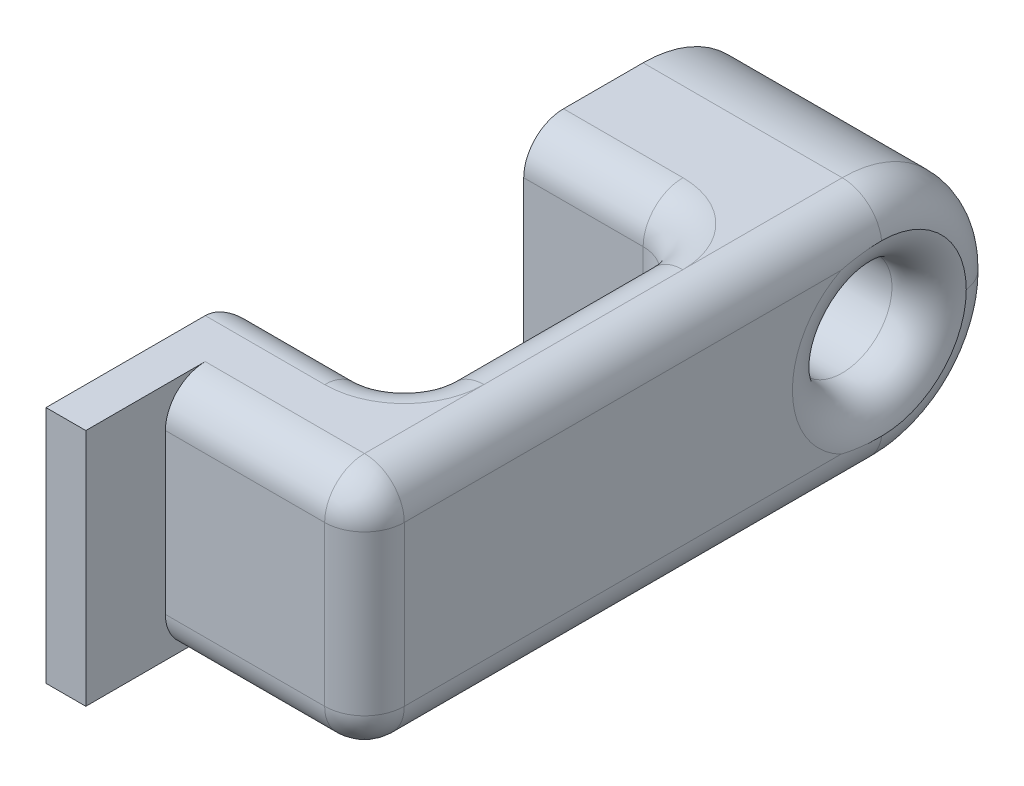
ISO-10303-21;
HEADER;
FILE_DESCRIPTION(('STEP AP214'),'2;1');
FILE_NAME('part.step','',(''),(''),'','','');
FILE_SCHEMA(('AUTOMOTIVE_DESIGN { 1 0 10303 214 1 1 1 1 }'));
ENDSEC;
DATA;
#1=APPLICATION_CONTEXT('core data for automotive mechanical design processes');
#2=APPLICATION_PROTOCOL_DEFINITION('international standard','automotive_design',2000,#1);
#3=PRODUCT_CONTEXT('',#1,'mechanical');
#4=PRODUCT('Part','Part','',(#3));
#5=PRODUCT_RELATED_PRODUCT_CATEGORY('part','',(#4));
#6=PRODUCT_DEFINITION_FORMATION('','',#4);
#7=PRODUCT_DEFINITION_CONTEXT('part definition',#1,'design');
#8=PRODUCT_DEFINITION('design','',#6,#7);
#9=PRODUCT_DEFINITION_SHAPE('','',#8);
#10=(LENGTH_UNIT() NAMED_UNIT(*) SI_UNIT(.MILLI.,.METRE.));
#11=(NAMED_UNIT(*) PLANE_ANGLE_UNIT() SI_UNIT($,.RADIAN.));
#12=(NAMED_UNIT(*) SI_UNIT($,.STERADIAN.) SOLID_ANGLE_UNIT());
#13=UNCERTAINTY_MEASURE_WITH_UNIT(LENGTH_MEASURE(1.E-05),#10,'distance_accuracy_value','');
#14=(GEOMETRIC_REPRESENTATION_CONTEXT(3) GLOBAL_UNCERTAINTY_ASSIGNED_CONTEXT((#13)) GLOBAL_UNIT_ASSIGNED_CONTEXT((#10,
#11,#12)) REPRESENTATION_CONTEXT('',''));
#15=CARTESIAN_POINT('',(0.,0.,0.));
#16=DIRECTION('',(0.,0.,1.));
#17=DIRECTION('',(1.,0.,0.));
#18=AXIS2_PLACEMENT_3D('',#15,#16,#17);
#19=CARTESIAN_POINT('',(0.,0.,0.));
#20=DIRECTION('',(0.,-1.,0.));
#21=DIRECTION('',(0.,0.,-1.));
#22=AXIS2_PLACEMENT_3D('',#19,#20,#21);
#23=PLANE('',#22);
#24=CARTESIAN_POINT('',(3.,0.,-11.));
#25=DIRECTION('',(0.,-1.,0.));
#26=DIRECTION('',(0.,0.,-1.));
#27=AXIS2_PLACEMENT_3D('',#24,#25,#26);
#28=CIRCLE('',#27,2.);
#29=CARTESIAN_POINT('',(3.,0.,-13.));
#30=VERTEX_POINT('',#29);
#31=CARTESIAN_POINT('',(5.,0.,-11.));
#32=VERTEX_POINT('',#31);
#33=EDGE_CURVE('E302',#30,#32,#28,.T.);
#34=ORIENTED_EDGE('',*,*,#33,.F.);
#35=DIRECTION('',(1.,0.,0.));
#36=VECTOR('',#35,1.);
#37=CARTESIAN_POINT('',(0.,0.,-13.));
#38=LINE('',#37,#36);
#39=CARTESIAN_POINT('',(0.,0.,-13.));
#40=VERTEX_POINT('',#39);
#41=EDGE_CURVE('E305',#30,#40,#38,.F.);
#42=ORIENTED_EDGE('',*,*,#41,.T.);
#43=DIRECTION('',(0.,0.,1.));
#44=VECTOR('',#43,1.);
#45=CARTESIAN_POINT('',(0.,0.,-12.));
#46=LINE('',#45,#44);
#47=CARTESIAN_POINT('',(0.,0.,-15.));
#48=VERTEX_POINT('',#47);
#49=EDGE_CURVE('E487',#48,#40,#46,.T.);
#50=ORIENTED_EDGE('',*,*,#49,.F.);
#51=DIRECTION('',(-1.,0.,0.));
#52=VECTOR('',#51,1.);
#53=CARTESIAN_POINT('',(6.,0.,-15.));
#54=LINE('',#53,#52);
#55=CARTESIAN_POINT('',(5.,0.,-15.));
#56=VERTEX_POINT('',#55);
#57=EDGE_CURVE('E244',#48,#56,#54,.F.);
#58=ORIENTED_EDGE('',*,*,#57,.T.);
#59=DIRECTION('',(0.,0.,-1.));
#60=VECTOR('',#59,1.);
#61=CARTESIAN_POINT('',(5.,0.,-2.));
#62=LINE('',#61,#60);
#63=EDGE_CURVE('E300',#56,#32,#62,.F.);
#64=ORIENTED_EDGE('',*,*,#63,.T.);
#65=EDGE_LOOP('',(#34,#42,#50,#58,#64));
#66=FACE_BOUND('',#65,.T.);
#67=ADVANCED_FACE('F39',(#66),#23,.T.);
#68=CARTESIAN_POINT('',(0.,6.,0.));
#69=DIRECTION('',(0.,-1.,0.));
#70=DIRECTION('',(0.,0.,-1.));
#71=AXIS2_PLACEMENT_3D('',#68,#69,#70);
#72=PLANE('',#71);
#73=DIRECTION('',(0.,0.,1.));
#74=VECTOR('',#73,1.);
#75=CARTESIAN_POINT('',(0.,6.,-12.));
#76=LINE('',#75,#74);
#77=CARTESIAN_POINT('',(0.,6.,-15.));
#78=VERTEX_POINT('',#77);
#79=CARTESIAN_POINT('',(0.,6.,-13.));
#80=VERTEX_POINT('',#79);
#81=EDGE_CURVE('E217',#78,#80,#76,.T.);
#82=ORIENTED_EDGE('',*,*,#81,.T.);
#83=DIRECTION('',(1.,0.,0.));
#84=VECTOR('',#83,1.);
#85=CARTESIAN_POINT('',(0.,6.,-13.));
#86=LINE('',#85,#84);
#87=CARTESIAN_POINT('',(3.,6.,-13.));
#88=VERTEX_POINT('',#87);
#89=EDGE_CURVE('E268',#80,#88,#86,.T.);
#90=ORIENTED_EDGE('',*,*,#89,.T.);
#91=CARTESIAN_POINT('',(3.,6.,-11.));
#92=DIRECTION('',(0.,-1.,0.));
#93=DIRECTION('',(0.,0.,-1.));
#94=AXIS2_PLACEMENT_3D('',#91,#92,#93);
#95=CIRCLE('',#94,2.);
#96=CARTESIAN_POINT('',(5.,6.,-11.));
#97=VERTEX_POINT('',#96);
#98=EDGE_CURVE('E265',#97,#88,#95,.F.);
#99=ORIENTED_EDGE('',*,*,#98,.F.);
#100=DIRECTION('',(0.,0.,-1.));
#101=VECTOR('',#100,1.);
#102=CARTESIAN_POINT('',(5.,6.,0.));
#103=LINE('',#102,#101);
#104=CARTESIAN_POINT('',(5.,6.,-15.));
#105=VERTEX_POINT('',#104);
#106=EDGE_CURVE('E262',#97,#105,#103,.T.);
#107=ORIENTED_EDGE('',*,*,#106,.T.);
#108=DIRECTION('',(-1.,0.,0.));
#109=VECTOR('',#108,1.);
#110=CARTESIAN_POINT('',(0.,6.,-15.));
#111=LINE('',#110,#109);
#112=EDGE_CURVE('E247',#105,#78,#111,.T.);
#113=ORIENTED_EDGE('',*,*,#112,.T.);
#114=EDGE_LOOP('',(#82,#90,#99,#107,#113));
#115=FACE_BOUND('',#114,.T.);
#116=ADVANCED_FACE('F522',(#115),#72,.F.);
#117=CARTESIAN_POINT('',(1.,6.,0.));
#118=DIRECTION('',(0.,0.,-1.));
#119=DIRECTION('',(-1.,0.,0.));
#120=AXIS2_PLACEMENT_3D('',#117,#118,#119);
#121=PLANE('',#120);
#122=DIRECTION('',(1.,0.,0.));
#123=VECTOR('',#122,1.);
#124=CARTESIAN_POINT('',(1.,0.,0.));
#125=LINE('',#124,#123);
#126=CARTESIAN_POINT('',(0.,0.,0.));
#127=VERTEX_POINT('',#126);
#128=CARTESIAN_POINT('',(1.,0.,0.));
#129=VERTEX_POINT('',#128);
#130=EDGE_CURVE('E232',#127,#129,#125,.T.);
#131=ORIENTED_EDGE('',*,*,#130,.T.);
#132=DIRECTION('',(0.,-1.,0.));
#133=VECTOR('',#132,1.);
#134=CARTESIAN_POINT('',(1.,6.,0.));
#135=LINE('',#134,#133);
#136=CARTESIAN_POINT('',(1.,6.,0.));
#137=VERTEX_POINT('',#136);
#138=EDGE_CURVE('E210',#137,#129,#135,.T.);
#139=ORIENTED_EDGE('',*,*,#138,.F.);
#140=DIRECTION('',(1.,0.,0.));
#141=VECTOR('',#140,1.);
#142=CARTESIAN_POINT('',(1.,6.,0.));
#143=LINE('',#142,#141);
#144=CARTESIAN_POINT('',(0.,6.,0.));
#145=VERTEX_POINT('',#144);
#146=EDGE_CURVE('E218',#145,#137,#143,.T.);
#147=ORIENTED_EDGE('',*,*,#146,.F.);
#148=DIRECTION('',(0.,-1.,0.));
#149=VECTOR('',#148,1.);
#150=CARTESIAN_POINT('',(0.,6.,0.));
#151=LINE('',#150,#149);
#152=EDGE_CURVE('E496',#145,#127,#151,.T.);
#153=ORIENTED_EDGE('',*,*,#152,.T.);
#154=EDGE_LOOP('',(#131,#139,#147,#153));
#155=FACE_BOUND('',#154,.T.);
#156=ADVANCED_FACE('F230',(#155),#121,.F.);
#157=CARTESIAN_POINT('',(1.,6.,-2.));
#158=DIRECTION('',(-1.,0.,0.));
#159=DIRECTION('',(0.,0.,1.));
#160=AXIS2_PLACEMENT_3D('',#157,#158,#159);
#161=PLANE('',#160);
#162=DIRECTION('',(0.,0.,-1.));
#163=VECTOR('',#162,1.);
#164=CARTESIAN_POINT('',(1.,0.,-2.));
#165=LINE('',#164,#163);
#166=CARTESIAN_POINT('',(1.,0.,-3.));
#167=VERTEX_POINT('',#166);
#168=EDGE_CURVE('E490',#129,#167,#165,.T.);
#169=ORIENTED_EDGE('',*,*,#168,.T.);
#170=CARTESIAN_POINT('',(1.,1.,-3.));
#171=DIRECTION('',(-1.,0.,0.));
#172=DIRECTION('',(0.,0.,1.));
#173=AXIS2_PLACEMENT_3D('',#170,#171,#172);
#174=CIRCLE('',#173,1.);
#175=CARTESIAN_POINT('',(1.,1.,-2.));
#176=VERTEX_POINT('',#175);
#177=EDGE_CURVE('E337',#167,#176,#174,.T.);
#178=ORIENTED_EDGE('',*,*,#177,.T.);
#179=DIRECTION('',(0.,-1.,0.));
#180=VECTOR('',#179,1.);
#181=CARTESIAN_POINT('',(1.,6.,-2.));
#182=LINE('',#181,#180);
#183=CARTESIAN_POINT('',(1.,5.,-2.));
#184=VERTEX_POINT('',#183);
#185=EDGE_CURVE('E234',#184,#176,#182,.T.);
#186=ORIENTED_EDGE('',*,*,#185,.F.);
#187=CARTESIAN_POINT('',(1.,5.,-3.));
#188=DIRECTION('',(-1.,0.,0.));
#189=DIRECTION('',(0.,0.,1.));
#190=AXIS2_PLACEMENT_3D('',#187,#188,#189);
#191=CIRCLE('',#190,1.);
#192=CARTESIAN_POINT('',(1.,6.,-3.));
#193=VERTEX_POINT('',#192);
#194=EDGE_CURVE('E214',#184,#193,#191,.T.);
#195=ORIENTED_EDGE('',*,*,#194,.T.);
#196=DIRECTION('',(0.,0.,-1.));
#197=VECTOR('',#196,1.);
#198=CARTESIAN_POINT('',(1.,6.,-2.));
#199=LINE('',#198,#197);
#200=EDGE_CURVE('E206',#137,#193,#199,.T.);
#201=ORIENTED_EDGE('',*,*,#200,.F.);
#202=ORIENTED_EDGE('',*,*,#138,.T.);
#203=EDGE_LOOP('',(#169,#178,#186,#195,#201,#202));
#204=FACE_BOUND('',#203,.T.);
#205=ADVANCED_FACE('F208',(#204),#161,.F.);
#206=CARTESIAN_POINT('',(6.,6.,-2.));
#207=DIRECTION('',(0.,0.,-1.));
#208=DIRECTION('',(-1.,0.,0.));
#209=AXIS2_PLACEMENT_3D('',#206,#207,#208);
#210=PLANE('',#209);
#211=DIRECTION('',(0.,-1.,0.));
#212=VECTOR('',#211,1.);
#213=CARTESIAN_POINT('',(5.,6.,-2.));
#214=LINE('',#213,#212);
#215=CARTESIAN_POINT('',(5.,1.,-2.));
#216=VERTEX_POINT('',#215);
#217=CARTESIAN_POINT('',(5.,5.,-2.));
#218=VERTEX_POINT('',#217);
#219=EDGE_CURVE('E330',#216,#218,#214,.F.);
#220=ORIENTED_EDGE('',*,*,#219,.T.);
#221=DIRECTION('',(1.,0.,0.));
#222=VECTOR('',#221,1.);
#223=CARTESIAN_POINT('',(6.,5.,-2.));
#224=LINE('',#223,#222);
#225=EDGE_CURVE('E334',#218,#184,#224,.F.);
#226=ORIENTED_EDGE('',*,*,#225,.T.);
#227=ORIENTED_EDGE('',*,*,#185,.T.);
#228=DIRECTION('',(1.,0.,0.));
#229=VECTOR('',#228,1.);
#230=CARTESIAN_POINT('',(6.,1.,-2.));
#231=LINE('',#230,#229);
#232=EDGE_CURVE('E332',#176,#216,#231,.T.);
#233=ORIENTED_EDGE('',*,*,#232,.T.);
#234=EDGE_LOOP('',(#220,#226,#227,#233));
#235=FACE_BOUND('',#234,.T.);
#236=ADVANCED_FACE('F541',(#235),#210,.F.);
#237=CARTESIAN_POINT('',(6.,6.,-18.));
#238=DIRECTION('',(-1.,0.,0.));
#239=DIRECTION('',(0.,0.,1.));
#240=AXIS2_PLACEMENT_3D('',#237,#238,#239);
#241=PLANE('',#240);
#242=DIRECTION('',(0.,0.,-1.));
#243=VECTOR('',#242,1.);
#244=CARTESIAN_POINT('',(6.,1.,-15.));
#245=LINE('',#244,#243);
#246=CARTESIAN_POINT('',(6.,1.,-3.));
#247=VERTEX_POINT('',#246);
#248=CARTESIAN_POINT('',(6.,1.,-13.9692235935956));
#249=VERTEX_POINT('',#248);
#250=EDGE_CURVE('E309',#247,#249,#245,.T.);
#251=ORIENTED_EDGE('',*,*,#250,.T.);
#252=CARTESIAN_POINT('',(6.,3.,-15.));
#253=DIRECTION('',(-1.,0.,0.));
#254=DIRECTION('',(0.,0.,1.));
#255=AXIS2_PLACEMENT_3D('',#252,#253,#254);
#256=CIRCLE('',#255,2.25);
#257=CARTESIAN_POINT('',(6.,5.,-13.9692235935956));
#258=VERTEX_POINT('',#257);
#259=EDGE_CURVE('E339',#249,#258,#256,.T.);
#260=ORIENTED_EDGE('',*,*,#259,.T.);
#261=DIRECTION('',(0.,0.,-1.));
#262=VECTOR('',#261,1.);
#263=CARTESIAN_POINT('',(6.,5.,-18.));
#264=LINE('',#263,#262);
#265=CARTESIAN_POINT('',(6.,5.,-3.));
#266=VERTEX_POINT('',#265);
#267=EDGE_CURVE('E312',#258,#266,#264,.F.);
#268=ORIENTED_EDGE('',*,*,#267,.T.);
#269=DIRECTION('',(0.,-1.,0.));
#270=VECTOR('',#269,1.);
#271=CARTESIAN_POINT('',(6.,6.,-3.));
#272=LINE('',#271,#270);
#273=EDGE_CURVE('E307',#266,#247,#272,.T.);
#274=ORIENTED_EDGE('',*,*,#273,.T.);
#275=EDGE_LOOP('',(#251,#260,#268,#274));
#276=FACE_BOUND('',#275,.T.);
#277=ADVANCED_FACE('F464',(#276),#241,.F.);
#278=CARTESIAN_POINT('',(0.,6.,-12.));
#279=DIRECTION('',(1.,0.,0.));
#280=DIRECTION('',(0.,0.,-1.));
#281=AXIS2_PLACEMENT_3D('',#278,#279,#280);
#282=PLANE('',#281);
#283=CARTESIAN_POINT('',(0.,3.,-15.));
#284=DIRECTION('',(-1.,0.,0.));
#285=DIRECTION('',(0.,0.,1.));
#286=AXIS2_PLACEMENT_3D('',#283,#284,#285);
#287=CIRCLE('',#286,1.25);
#288=CARTESIAN_POINT('',(0.,3.,-13.75));
#289=VERTEX_POINT('',#288);
#290=EDGE_CURVE('E343',#289,#289,#287,.T.);
#291=ORIENTED_EDGE('',*,*,#290,.F.);
#292=EDGE_LOOP('',(#291));
#293=FACE_BOUND('',#292,.T.);
#294=DIRECTION('',(0.,-1.,0.));
#295=VECTOR('',#294,1.);
#296=CARTESIAN_POINT('',(0.,6.,-12.));
#297=LINE('',#296,#295);
#298=CARTESIAN_POINT('',(0.,5.,-12.));
#299=VERTEX_POINT('',#298);
#300=CARTESIAN_POINT('',(0.,1.,-12.));
#301=VERTEX_POINT('',#300);
#302=EDGE_CURVE('E239',#299,#301,#297,.T.);
#303=ORIENTED_EDGE('',*,*,#302,.F.);
#304=CARTESIAN_POINT('',(0.,5.,-13.));
#305=DIRECTION('',(1.,0.,0.));
#306=DIRECTION('',(0.,0.,-1.));
#307=AXIS2_PLACEMENT_3D('',#304,#305,#306);
#308=CIRCLE('',#307,1.);
#309=EDGE_CURVE('E279',#299,#80,#308,.F.);
#310=ORIENTED_EDGE('',*,*,#309,.T.);
#311=ORIENTED_EDGE('',*,*,#81,.F.);
#312=CARTESIAN_POINT('',(0.,3.,-15.));
#313=DIRECTION('',(1.,0.,0.));
#314=DIRECTION('',(0.,0.,-1.));
#315=AXIS2_PLACEMENT_3D('',#312,#313,#314);
#316=CIRCLE('',#315,3.);
#317=CARTESIAN_POINT('',(0.,3.,-18.));
#318=VERTEX_POINT('',#317);
#319=EDGE_CURVE('E233',#78,#318,#316,.F.);
#320=ORIENTED_EDGE('',*,*,#319,.T.);
#321=CARTESIAN_POINT('',(0.,3.,-15.));
#322=DIRECTION('',(1.,0.,0.));
#323=DIRECTION('',(0.,0.,-1.));
#324=AXIS2_PLACEMENT_3D('',#321,#322,#323);
#325=CIRCLE('',#324,3.);
#326=EDGE_CURVE('E236',#318,#48,#325,.F.);
#327=ORIENTED_EDGE('',*,*,#326,.T.);
#328=ORIENTED_EDGE('',*,*,#49,.T.);
#329=CARTESIAN_POINT('',(0.,1.,-13.));
#330=DIRECTION('',(1.,0.,0.));
#331=DIRECTION('',(0.,0.,-1.));
#332=AXIS2_PLACEMENT_3D('',#329,#330,#331);
#333=CIRCLE('',#332,1.);
#334=EDGE_CURVE('E277',#40,#301,#333,.F.);
#335=ORIENTED_EDGE('',*,*,#334,.T.);
#336=EDGE_LOOP('',(#303,#310,#311,#320,#327,#328,#335));
#337=FACE_BOUND('',#336,.T.);
#338=ADVANCED_FACE('F532',(#293,#337),#282,.F.);
#339=CARTESIAN_POINT('',(4.,6.,-12.));
#340=DIRECTION('',(0.,0.,-1.));
#341=DIRECTION('',(-1.,0.,0.));
#342=AXIS2_PLACEMENT_3D('',#339,#340,#341);
#343=PLANE('',#342);
#344=DIRECTION('',(0.,-1.,0.));
#345=VECTOR('',#344,1.);
#346=CARTESIAN_POINT('',(3.,6.,-12.));
#347=LINE('',#346,#345);
#348=CARTESIAN_POINT('',(3.,1.,-12.));
#349=VERTEX_POINT('',#348);
#350=CARTESIAN_POINT('',(3.,5.,-12.));
#351=VERTEX_POINT('',#350);
#352=EDGE_CURVE('E271',#349,#351,#347,.F.);
#353=ORIENTED_EDGE('',*,*,#352,.T.);
#354=DIRECTION('',(1.,0.,0.));
#355=VECTOR('',#354,1.);
#356=CARTESIAN_POINT('',(4.,5.,-12.));
#357=LINE('',#356,#355);
#358=EDGE_CURVE('E275',#351,#299,#357,.F.);
#359=ORIENTED_EDGE('',*,*,#358,.T.);
#360=ORIENTED_EDGE('',*,*,#302,.T.);
#361=DIRECTION('',(1.,0.,0.));
#362=VECTOR('',#361,1.);
#363=CARTESIAN_POINT('',(4.,1.,-12.));
#364=LINE('',#363,#362);
#365=EDGE_CURVE('E273',#301,#349,#364,.T.);
#366=ORIENTED_EDGE('',*,*,#365,.T.);
#367=EDGE_LOOP('',(#353,#359,#360,#366));
#368=FACE_BOUND('',#367,.T.);
#369=ADVANCED_FACE('F501',(#368),#343,.F.);
#370=CARTESIAN_POINT('',(4.,6.,-5.));
#371=DIRECTION('',(1.,0.,0.));
#372=DIRECTION('',(0.,0.,-1.));
#373=AXIS2_PLACEMENT_3D('',#370,#371,#372);
#374=PLANE('',#373);
#375=DIRECTION('',(0.,0.,1.));
#376=VECTOR('',#375,1.);
#377=CARTESIAN_POINT('',(4.,5.,-5.));
#378=LINE('',#377,#376);
#379=CARTESIAN_POINT('',(4.,5.,-6.));
#380=VERTEX_POINT('',#379);
#381=CARTESIAN_POINT('',(4.,5.,-11.));
#382=VERTEX_POINT('',#381);
#383=EDGE_CURVE('E325',#380,#382,#378,.F.);
#384=ORIENTED_EDGE('',*,*,#383,.T.);
#385=DIRECTION('',(0.,-1.,0.));
#386=VECTOR('',#385,1.);
#387=CARTESIAN_POINT('',(4.,0.,-11.));
#388=LINE('',#387,#386);
#389=CARTESIAN_POINT('',(4.,1.,-11.));
#390=VERTEX_POINT('',#389);
#391=EDGE_CURVE('E328',#382,#390,#388,.T.);
#392=ORIENTED_EDGE('',*,*,#391,.T.);
#393=DIRECTION('',(0.,0.,1.));
#394=VECTOR('',#393,1.);
#395=CARTESIAN_POINT('',(4.,1.,-5.));
#396=LINE('',#395,#394);
#397=CARTESIAN_POINT('',(4.,1.,-6.));
#398=VERTEX_POINT('',#397);
#399=EDGE_CURVE('E323',#390,#398,#396,.T.);
#400=ORIENTED_EDGE('',*,*,#399,.T.);
#401=DIRECTION('',(0.,-1.,0.));
#402=VECTOR('',#401,1.);
#403=CARTESIAN_POINT('',(4.,6.,-6.));
#404=LINE('',#403,#402);
#405=EDGE_CURVE('E321',#398,#380,#404,.F.);
#406=ORIENTED_EDGE('',*,*,#405,.T.);
#407=EDGE_LOOP('',(#384,#392,#400,#406));
#408=FACE_BOUND('',#407,.T.);
#409=ADVANCED_FACE('F539',(#408),#374,.F.);
#410=CARTESIAN_POINT('',(0.,6.,-5.));
#411=DIRECTION('',(0.,0.,1.));
#412=DIRECTION('',(1.,0.,0.));
#413=AXIS2_PLACEMENT_3D('',#410,#411,#412);
#414=PLANE('',#413);
#415=DIRECTION('',(-1.,0.,0.));
#416=VECTOR('',#415,1.);
#417=CARTESIAN_POINT('',(0.,1.,-5.));
#418=LINE('',#417,#416);
#419=CARTESIAN_POINT('',(3.,1.,-5.));
#420=VERTEX_POINT('',#419);
#421=CARTESIAN_POINT('',(1.,1.,-5.));
#422=VERTEX_POINT('',#421);
#423=EDGE_CURVE('E283',#420,#422,#418,.T.);
#424=ORIENTED_EDGE('',*,*,#423,.T.);
#425=DIRECTION('',(0.,-1.,0.));
#426=VECTOR('',#425,1.);
#427=CARTESIAN_POINT('',(1.,6.,-5.));
#428=LINE('',#427,#426);
#429=CARTESIAN_POINT('',(1.,5.,-5.));
#430=VERTEX_POINT('',#429);
#431=EDGE_CURVE('E288',#422,#430,#428,.F.);
#432=ORIENTED_EDGE('',*,*,#431,.T.);
#433=DIRECTION('',(-1.,0.,0.));
#434=VECTOR('',#433,1.);
#435=CARTESIAN_POINT('',(0.,5.,-5.));
#436=LINE('',#435,#434);
#437=CARTESIAN_POINT('',(3.,5.,-5.));
#438=VERTEX_POINT('',#437);
#439=EDGE_CURVE('E285',#430,#438,#436,.F.);
#440=ORIENTED_EDGE('',*,*,#439,.T.);
#441=DIRECTION('',(0.,-1.,0.));
#442=VECTOR('',#441,1.);
#443=CARTESIAN_POINT('',(3.,0.,-5.));
#444=LINE('',#443,#442);
#445=EDGE_CURVE('E281',#438,#420,#444,.T.);
#446=ORIENTED_EDGE('',*,*,#445,.T.);
#447=EDGE_LOOP('',(#424,#432,#440,#446));
#448=FACE_BOUND('',#447,.T.);
#449=ADVANCED_FACE('F589',(#448),#414,.F.);
#450=CARTESIAN_POINT('',(0.,6.,0.));
#451=DIRECTION('',(1.,0.,0.));
#452=DIRECTION('',(0.,0.,-1.));
#453=AXIS2_PLACEMENT_3D('',#450,#451,#452);
#454=PLANE('',#453);
#455=DIRECTION('',(0.,0.,1.));
#456=VECTOR('',#455,1.);
#457=CARTESIAN_POINT('',(0.,6.,0.));
#458=LINE('',#457,#456);
#459=CARTESIAN_POINT('',(0.,6.,-4.));
#460=VERTEX_POINT('',#459);
#461=EDGE_CURVE('E224',#460,#145,#458,.T.);
#462=ORIENTED_EDGE('',*,*,#461,.F.);
#463=DIRECTION('',(0.,-1.,0.));
#464=VECTOR('',#463,1.);
#465=CARTESIAN_POINT('',(0.,6.,-4.));
#466=LINE('',#465,#464);
#467=CARTESIAN_POINT('',(0.,0.,-4.));
#468=VERTEX_POINT('',#467);
#469=EDGE_CURVE('E319',#460,#468,#466,.T.);
#470=ORIENTED_EDGE('',*,*,#469,.T.);
#471=DIRECTION('',(0.,0.,1.));
#472=VECTOR('',#471,1.);
#473=CARTESIAN_POINT('',(0.,0.,0.));
#474=LINE('',#473,#472);
#475=EDGE_CURVE('E228',#468,#127,#474,.T.);
#476=ORIENTED_EDGE('',*,*,#475,.T.);
#477=ORIENTED_EDGE('',*,*,#152,.F.);
#478=EDGE_LOOP('',(#462,#470,#476,#477));
#479=FACE_BOUND('',#478,.T.);
#480=ADVANCED_FACE('F558',(#479),#454,.F.);
#481=CARTESIAN_POINT('',(3.,6.,-6.));
#482=DIRECTION('',(0.,-1.,0.));
#483=DIRECTION('',(0.,0.,-1.));
#484=AXIS2_PLACEMENT_3D('',#481,#482,#483);
#485=CIRCLE('',#484,2.);
#486=CARTESIAN_POINT('',(3.,6.,-4.));
#487=VERTEX_POINT('',#486);
#488=CARTESIAN_POINT('',(5.,6.,-6.));
#489=VERTEX_POINT('',#488);
#490=EDGE_CURVE('E257',#487,#489,#485,.F.);
#491=ORIENTED_EDGE('',*,*,#490,.F.);
#492=DIRECTION('',(-1.,0.,0.));
#493=VECTOR('',#492,1.);
#494=CARTESIAN_POINT('',(0.,6.,-4.));
#495=LINE('',#494,#493);
#496=EDGE_CURVE('E260',#487,#460,#495,.T.);
#497=ORIENTED_EDGE('',*,*,#496,.T.);
#498=ORIENTED_EDGE('',*,*,#461,.T.);
#499=ORIENTED_EDGE('',*,*,#146,.T.);
#500=ORIENTED_EDGE('',*,*,#200,.T.);
#501=DIRECTION('',(1.,0.,0.));
#502=VECTOR('',#501,1.);
#503=CARTESIAN_POINT('',(0.,6.,-3.));
#504=LINE('',#503,#502);
#505=CARTESIAN_POINT('',(5.,6.,-3.));
#506=VERTEX_POINT('',#505);
#507=EDGE_CURVE('E249',#193,#506,#504,.T.);
#508=ORIENTED_EDGE('',*,*,#507,.T.);
#509=DIRECTION('',(0.,0.,-1.));
#510=VECTOR('',#509,1.);
#511=CARTESIAN_POINT('',(5.,6.,0.));
#512=LINE('',#511,#510);
#513=EDGE_CURVE('E255',#506,#489,#512,.T.);
#514=ORIENTED_EDGE('',*,*,#513,.T.);
#515=EDGE_LOOP('',(#491,#497,#498,#499,#500,#508,#514));
#516=FACE_BOUND('',#515,.T.);
#517=ADVANCED_FACE('F221',(#516),#72,.F.);
#518=DIRECTION('',(1.,0.,0.));
#519=VECTOR('',#518,1.);
#520=CARTESIAN_POINT('',(1.,0.,-3.));
#521=LINE('',#520,#519);
#522=CARTESIAN_POINT('',(5.,0.,-3.));
#523=VERTEX_POINT('',#522);
#524=EDGE_CURVE('E292',#523,#167,#521,.F.);
#525=ORIENTED_EDGE('',*,*,#524,.T.);
#526=ORIENTED_EDGE('',*,*,#168,.F.);
#527=ORIENTED_EDGE('',*,*,#130,.F.);
#528=ORIENTED_EDGE('',*,*,#475,.F.);
#529=DIRECTION('',(-1.,0.,0.));
#530=VECTOR('',#529,1.);
#531=CARTESIAN_POINT('',(4.,0.,-4.));
#532=LINE('',#531,#530);
#533=CARTESIAN_POINT('',(3.,0.,-4.));
#534=VERTEX_POINT('',#533);
#535=EDGE_CURVE('E298',#468,#534,#532,.F.);
#536=ORIENTED_EDGE('',*,*,#535,.T.);
#537=CARTESIAN_POINT('',(3.,0.,-6.));
#538=DIRECTION('',(0.,-1.,0.));
#539=DIRECTION('',(0.,0.,-1.));
#540=AXIS2_PLACEMENT_3D('',#537,#538,#539);
#541=CIRCLE('',#540,2.);
#542=CARTESIAN_POINT('',(5.,0.,-6.));
#543=VERTEX_POINT('',#542);
#544=EDGE_CURVE('E295',#543,#534,#541,.T.);
#545=ORIENTED_EDGE('',*,*,#544,.F.);
#546=DIRECTION('',(0.,0.,-1.));
#547=VECTOR('',#546,1.);
#548=CARTESIAN_POINT('',(5.,0.,-2.));
#549=LINE('',#548,#547);
#550=EDGE_CURVE('E290',#543,#523,#549,.F.);
#551=ORIENTED_EDGE('',*,*,#550,.T.);
#552=EDGE_LOOP('',(#525,#526,#527,#528,#536,#545,#551));
#553=FACE_BOUND('',#552,.T.);
#554=ADVANCED_FACE('F545',(#553),#23,.T.);
#555=CARTESIAN_POINT('',(0.,3.,-15.));
#556=DIRECTION('',(-1.,0.,0.));
#557=DIRECTION('',(0.,0.,1.));
#558=AXIS2_PLACEMENT_3D('',#555,#556,#557);
#559=CYLINDRICAL_SURFACE('',#558,3.);
#560=ORIENTED_EDGE('',*,*,#112,.F.);
#561=CARTESIAN_POINT('',(5.,3.,-15.));
#562=DIRECTION('',(-1.,0.,0.));
#563=DIRECTION('',(0.,0.,1.));
#564=AXIS2_PLACEMENT_3D('',#561,#562,#563);
#565=CIRCLE('',#564,3.);
#566=CARTESIAN_POINT('',(5.,3.,-18.));
#567=VERTEX_POINT('',#566);
#568=EDGE_CURVE('E314',#105,#567,#565,.T.);
#569=ORIENTED_EDGE('',*,*,#568,.T.);
#570=DIRECTION('',(-1.,0.,0.));
#571=VECTOR('',#570,1.);
#572=CARTESIAN_POINT('',(0.,3.,-18.));
#573=LINE('',#572,#571);
#574=EDGE_CURVE('E250',#318,#567,#573,.F.);
#575=ORIENTED_EDGE('',*,*,#574,.F.);
#576=ORIENTED_EDGE('',*,*,#319,.F.);
#577=EDGE_LOOP('',(#560,#569,#575,#576));
#578=FACE_BOUND('',#577,.T.);
#579=ADVANCED_FACE('F472',(#578),#559,.T.);
#580=CARTESIAN_POINT('',(0.,3.,-15.));
#581=DIRECTION('',(1.,0.,0.));
#582=DIRECTION('',(0.,0.,-1.));
#583=AXIS2_PLACEMENT_3D('',#580,#581,#582);
#584=CYLINDRICAL_SURFACE('',#583,3.);
#585=ORIENTED_EDGE('',*,*,#574,.T.);
#586=CARTESIAN_POINT('',(5.,3.,-15.));
#587=DIRECTION('',(-1.,0.,0.));
#588=DIRECTION('',(0.,0.,1.));
#589=AXIS2_PLACEMENT_3D('',#586,#587,#588);
#590=CIRCLE('',#589,3.);
#591=EDGE_CURVE('E317',#567,#56,#590,.T.);
#592=ORIENTED_EDGE('',*,*,#591,.T.);
#593=ORIENTED_EDGE('',*,*,#57,.F.);
#594=ORIENTED_EDGE('',*,*,#326,.F.);
#595=EDGE_LOOP('',(#585,#592,#593,#594));
#596=FACE_BOUND('',#595,.T.);
#597=ADVANCED_FACE('F477',(#596),#584,.T.);
#598=CARTESIAN_POINT('',(6.,1.,-3.));
#599=DIRECTION('',(-1.,0.,0.));
#600=DIRECTION('',(0.,0.,1.));
#601=AXIS2_PLACEMENT_3D('',#598,#599,#600);
#602=CYLINDRICAL_SURFACE('',#601,1.);
#603=ORIENTED_EDGE('',*,*,#177,.F.);
#604=ORIENTED_EDGE('',*,*,#524,.F.);
#605=CARTESIAN_POINT('',(5.,1.,-3.));
#606=DIRECTION('',(1.,0.,0.));
#607=DIRECTION('',(0.,0.,-1.));
#608=AXIS2_PLACEMENT_3D('',#605,#606,#607);
#609=CIRCLE('',#608,1.);
#610=EDGE_CURVE('E253',#216,#523,#609,.T.);
#611=ORIENTED_EDGE('',*,*,#610,.F.);
#612=ORIENTED_EDGE('',*,*,#232,.F.);
#613=EDGE_LOOP('',(#603,#604,#611,#612));
#614=FACE_BOUND('',#613,.T.);
#615=ADVANCED_FACE('F564',(#614),#602,.T.);
#616=CARTESIAN_POINT('',(0.,1.,-4.));
#617=DIRECTION('',(1.,0.,0.));
#618=DIRECTION('',(0.,0.,-1.));
#619=AXIS2_PLACEMENT_3D('',#616,#617,#618);
#620=CYLINDRICAL_SURFACE('',#619,1.);
#621=CARTESIAN_POINT('',(3.,1.,-4.));
#622=DIRECTION('',(1.,0.,0.));
#623=DIRECTION('',(0.,0.,-1.));
#624=AXIS2_PLACEMENT_3D('',#621,#622,#623);
#625=CIRCLE('',#624,1.);
#626=EDGE_CURVE('E397',#534,#420,#625,.T.);
#627=ORIENTED_EDGE('',*,*,#626,.F.);
#628=ORIENTED_EDGE('',*,*,#535,.F.);
#629=CARTESIAN_POINT('',(1.,1.,-4.));
#630=DIRECTION('',(0.707106781186547,-0.707106781186547,0.));
#631=DIRECTION('',(-0.707106781186547,-0.707106781186547,0.));
#632=AXIS2_PLACEMENT_3D('',#629,#630,#631);
#633=ELLIPSE('',#632,1.41421356237309,1.);
#634=EDGE_CURVE('E400',#422,#468,#633,.F.);
#635=ORIENTED_EDGE('',*,*,#634,.F.);
#636=ORIENTED_EDGE('',*,*,#423,.F.);
#637=EDGE_LOOP('',(#627,#628,#635,#636));
#638=FACE_BOUND('',#637,.T.);
#639=ADVANCED_FACE('F601',(#638),#620,.T.);
#640=CARTESIAN_POINT('',(5.,1.,-3.));
#641=DIRECTION('',(0.,0.,1.));
#642=DIRECTION('',(1.,0.,0.));
#643=AXIS2_PLACEMENT_3D('',#640,#641,#642);
#644=SPHERICAL_SURFACE('',#643,1.);
#645=CARTESIAN_POINT('',(5.,1.,-3.));
#646=DIRECTION('',(0.,0.,1.));
#647=DIRECTION('',(1.,0.,0.));
#648=AXIS2_PLACEMENT_3D('',#645,#646,#647);
#649=CIRCLE('',#648,1.);
#650=EDGE_CURVE('E394',#247,#523,#649,.F.);
#651=ORIENTED_EDGE('',*,*,#650,.F.);
#652=CARTESIAN_POINT('',(5.,1.,-3.));
#653=DIRECTION('',(0.,-1.,0.));
#654=DIRECTION('',(0.,0.,-1.));
#655=AXIS2_PLACEMENT_3D('',#652,#653,#654);
#656=CIRCLE('',#655,1.);
#657=EDGE_CURVE('E403',#216,#247,#656,.F.);
#658=ORIENTED_EDGE('',*,*,#657,.F.);
#659=ORIENTED_EDGE('',*,*,#610,.T.);
#660=EDGE_LOOP('',(#651,#658,#659));
#661=FACE_BOUND('',#660,.T.);
#662=ADVANCED_FACE('F607',(#661),#644,.T.);
#663=CARTESIAN_POINT('',(5.,3.,-15.));
#664=DIRECTION('',(-1.,0.,0.));
#665=DIRECTION('',(0.,0.,1.));
#666=AXIS2_PLACEMENT_3D('',#663,#664,#665);
#667=TOROIDAL_SURFACE('',#666,2.,1.);
#668=CARTESIAN_POINT('',(5.,3.,-17.));
#669=DIRECTION('',(0.,1.,0.));
#670=DIRECTION('',(0.,0.,1.));
#671=AXIS2_PLACEMENT_3D('',#668,#669,#670);
#672=CIRCLE('',#671,1.);
#673=CARTESIAN_POINT('',(5.99215674164922,3.,-17.125));
#674=VERTEX_POINT('',#673);
#675=EDGE_CURVE('E390',#674,#567,#672,.T.);
#676=ORIENTED_EDGE('',*,*,#675,.F.);
#677=CARTESIAN_POINT('',(5.99215674164922,3.,-15.));
#678=DIRECTION('',(-1.,0.,0.));
#679=DIRECTION('',(0.,0.,1.));
#680=AXIS2_PLACEMENT_3D('',#677,#678,#679);
#681=CIRCLE('',#680,2.125);
#682=CARTESIAN_POINT('',(5.99215674164922,0.875000000000002,-15.));
#683=VERTEX_POINT('',#682);
#684=EDGE_CURVE('E55',#674,#683,#681,.T.);
#685=ORIENTED_EDGE('',*,*,#684,.T.);
#686=CARTESIAN_POINT('',(5.,1.,-15.));
#687=DIRECTION('',(0.,0.,1.));
#688=DIRECTION('',(1.,0.,0.));
#689=AXIS2_PLACEMENT_3D('',#686,#687,#688);
#690=CIRCLE('',#689,1.);
#691=EDGE_CURVE('E392',#56,#683,#690,.T.);
#692=ORIENTED_EDGE('',*,*,#691,.F.);
#693=ORIENTED_EDGE('',*,*,#591,.F.);
#694=EDGE_LOOP('',(#676,#685,#692,#693));
#695=FACE_BOUND('',#694,.T.);
#696=ADVANCED_FACE('F479',(#695),#667,.T.);
#697=CARTESIAN_POINT('',(5.,6.,-3.));
#698=DIRECTION('',(0.,-1.,0.));
#699=DIRECTION('',(0.,0.,-1.));
#700=AXIS2_PLACEMENT_3D('',#697,#698,#699);
#701=CYLINDRICAL_SURFACE('',#700,1.);
#702=ORIENTED_EDGE('',*,*,#657,.T.);
#703=ORIENTED_EDGE('',*,*,#273,.F.);
#704=CARTESIAN_POINT('',(5.,5.,-3.));
#705=DIRECTION('',(0.,1.,0.));
#706=DIRECTION('',(0.,0.,1.));
#707=AXIS2_PLACEMENT_3D('',#704,#705,#706);
#708=CIRCLE('',#707,1.);
#709=EDGE_CURVE('E387',#218,#266,#708,.T.);
#710=ORIENTED_EDGE('',*,*,#709,.F.);
#711=ORIENTED_EDGE('',*,*,#219,.F.);
#712=EDGE_LOOP('',(#702,#703,#710,#711));
#713=FACE_BOUND('',#712,.T.);
#714=ADVANCED_FACE('F574',(#713),#701,.T.);
#715=CARTESIAN_POINT('',(0.,5.,-3.));
#716=DIRECTION('',(1.,0.,0.));
#717=DIRECTION('',(0.,0.,-1.));
#718=AXIS2_PLACEMENT_3D('',#715,#716,#717);
#719=CYLINDRICAL_SURFACE('',#718,1.);
#720=ORIENTED_EDGE('',*,*,#194,.F.);
#721=ORIENTED_EDGE('',*,*,#225,.F.);
#722=CARTESIAN_POINT('',(5.,5.,-3.));
#723=DIRECTION('',(1.,0.,0.));
#724=DIRECTION('',(0.,0.,-1.));
#725=AXIS2_PLACEMENT_3D('',#722,#723,#724);
#726=CIRCLE('',#725,1.);
#727=EDGE_CURVE('E384',#506,#218,#726,.T.);
#728=ORIENTED_EDGE('',*,*,#727,.F.);
#729=ORIENTED_EDGE('',*,*,#507,.F.);
#730=EDGE_LOOP('',(#720,#721,#728,#729));
#731=FACE_BOUND('',#730,.T.);
#732=ADVANCED_FACE('F571',(#731),#719,.T.);
#733=CARTESIAN_POINT('',(1.,6.,-4.));
#734=DIRECTION('',(0.,-1.,0.));
#735=DIRECTION('',(0.,0.,-1.));
#736=AXIS2_PLACEMENT_3D('',#733,#734,#735);
#737=CYLINDRICAL_SURFACE('',#736,1.);
#738=ORIENTED_EDGE('',*,*,#634,.T.);
#739=ORIENTED_EDGE('',*,*,#469,.F.);
#740=CARTESIAN_POINT('',(1.,5.,-4.));
#741=DIRECTION('',(-0.707106781186547,-0.707106781186547,0.));
#742=DIRECTION('',(0.707106781186547,-0.707106781186547,0.));
#743=AXIS2_PLACEMENT_3D('',#740,#741,#742);
#744=ELLIPSE('',#743,1.41421356237309,1.);
#745=EDGE_CURVE('E382',#430,#460,#744,.F.);
#746=ORIENTED_EDGE('',*,*,#745,.F.);
#747=ORIENTED_EDGE('',*,*,#431,.F.);
#748=EDGE_LOOP('',(#738,#739,#746,#747));
#749=FACE_BOUND('',#748,.T.);
#750=ADVANCED_FACE('F595',(#749),#737,.T.);
#751=CARTESIAN_POINT('',(3.,1.,-6.));
#752=DIRECTION('',(0.,-1.,0.));
#753=DIRECTION('',(0.,0.,-1.));
#754=AXIS2_PLACEMENT_3D('',#751,#752,#753);
#755=TOROIDAL_SURFACE('',#754,2.,1.);
#756=ORIENTED_EDGE('',*,*,#544,.T.);
#757=ORIENTED_EDGE('',*,*,#626,.T.);
#758=CARTESIAN_POINT('',(3.,1.,-6.));
#759=DIRECTION('',(0.,-1.,0.));
#760=DIRECTION('',(0.,0.,-1.));
#761=AXIS2_PLACEMENT_3D('',#758,#759,#760);
#762=CIRCLE('',#761,1.);
#763=EDGE_CURVE('E379',#398,#420,#762,.T.);
#764=ORIENTED_EDGE('',*,*,#763,.F.);
#765=CARTESIAN_POINT('',(5.,1.,-6.));
#766=DIRECTION('',(0.,0.,1.));
#767=DIRECTION('',(1.,0.,0.));
#768=AXIS2_PLACEMENT_3D('',#765,#766,#767);
#769=CIRCLE('',#768,1.);
#770=EDGE_CURVE('E376',#543,#398,#769,.F.);
#771=ORIENTED_EDGE('',*,*,#770,.F.);
#772=EDGE_LOOP('',(#756,#757,#764,#771));
#773=FACE_BOUND('',#772,.T.);
#774=ADVANCED_FACE('F452',(#773),#755,.T.);
#775=CARTESIAN_POINT('',(5.,1.,-18.));
#776=DIRECTION('',(0.,0.,1.));
#777=DIRECTION('',(1.,0.,0.));
#778=AXIS2_PLACEMENT_3D('',#775,#776,#777);
#779=CYLINDRICAL_SURFACE('',#778,1.);
#780=ORIENTED_EDGE('',*,*,#691,.T.);
#781=CARTESIAN_POINT('',(5.99215674164922,0.875000000000002,-15.));
#782=CARTESIAN_POINT('',(5.992111713765,0.874986361487827,-14.9137487325909));
#783=CARTESIAN_POINT('',(5.99248648609404,0.877625058867763,-14.827502908049));
#784=CARTESIAN_POINT('',(5.99374595904592,0.8881086816525,-14.6553186120264));
#785=CARTESIAN_POINT('',(5.99463073180807,0.89595434360377,-14.5693801857577));
#786=CARTESIAN_POINT('',(5.9965737656708,0.916683054104394,-14.3987109223612));
#787=CARTESIAN_POINT('',(5.99763081276138,0.929531669292683,-14.3139758489158));
#788=CARTESIAN_POINT('',(5.99932082638251,0.960086476629653,-14.1454046169668));
#789=CARTESIAN_POINT('',(5.9999539453385,0.977790919610554,-14.0615681460464));
#790=CARTESIAN_POINT('',(5.99999918244481,0.998534766399565,-13.9752782229377));
#791=CARTESIAN_POINT('',(5.99999999024088,0.999265857092806,-13.9722505245103));
#792=CARTESIAN_POINT('',(6.,1.,-13.9692235935956));
#793=B_SPLINE_CURVE_WITH_KNOTS('',3,(#781,#782,#783,#784,#785,#786,#787,#788,#789,#790,#791,
#792),.UNSPECIFIED.,.F.,.F.,(4,2,2,2,2,4),(0.,0.258704557019338,0.517445716659967,
0.774436674343809,1.03133517997423,1.0406793182345),.UNSPECIFIED.);
#794=EDGE_CURVE('E48',#683,#249,#793,.T.);
#795=ORIENTED_EDGE('',*,*,#794,.T.);
#796=ORIENTED_EDGE('',*,*,#250,.F.);
#797=ORIENTED_EDGE('',*,*,#650,.T.);
#798=ORIENTED_EDGE('',*,*,#550,.F.);
#799=DIRECTION('',(0.,0.,-1.));
#800=VECTOR('',#799,1.);
#801=CARTESIAN_POINT('',(5.,0.,-2.));
#802=LINE('',#801,#800);
#803=EDGE_CURVE('E373',#32,#543,#802,.F.);
#804=ORIENTED_EDGE('',*,*,#803,.F.);
#805=ORIENTED_EDGE('',*,*,#63,.F.);
#806=EDGE_LOOP('',(#780,#795,#796,#797,#798,#804,#805));
#807=FACE_BOUND('',#806,.T.);
#808=ADVANCED_FACE('F448',(#807),#779,.T.);
#809=CARTESIAN_POINT('',(5.,3.,-15.));
#810=DIRECTION('',(-1.,0.,0.));
#811=DIRECTION('',(0.,0.,1.));
#812=AXIS2_PLACEMENT_3D('',#809,#810,#811);
#813=TOROIDAL_SURFACE('',#812,2.,1.);
#814=CARTESIAN_POINT('',(5.,5.,-15.));
#815=DIRECTION('',(0.,0.,1.));
#816=DIRECTION('',(1.,0.,0.));
#817=AXIS2_PLACEMENT_3D('',#814,#815,#816);
#818=CIRCLE('',#817,1.);
#819=CARTESIAN_POINT('',(5.99215674164922,5.12499999999999,-15.));
#820=VERTEX_POINT('',#819);
#821=EDGE_CURVE('E371',#820,#105,#818,.T.);
#822=ORIENTED_EDGE('',*,*,#821,.F.);
#823=CARTESIAN_POINT('',(5.99215674164922,3.,-15.));
#824=DIRECTION('',(-1.,0.,0.));
#825=DIRECTION('',(0.,0.,1.));
#826=AXIS2_PLACEMENT_3D('',#823,#824,#825);
#827=CIRCLE('',#826,2.125);
#828=EDGE_CURVE('E63',#820,#674,#827,.T.);
#829=ORIENTED_EDGE('',*,*,#828,.T.);
#830=ORIENTED_EDGE('',*,*,#675,.T.);
#831=ORIENTED_EDGE('',*,*,#568,.F.);
#832=EDGE_LOOP('',(#822,#829,#830,#831));
#833=FACE_BOUND('',#832,.T.);
#834=ADVANCED_FACE('F444',(#833),#813,.T.);
#835=CARTESIAN_POINT('',(5.,5.,-3.));
#836=DIRECTION('',(0.,0.,1.));
#837=DIRECTION('',(1.,0.,0.));
#838=AXIS2_PLACEMENT_3D('',#835,#836,#837);
#839=SPHERICAL_SURFACE('',#838,1.);
#840=ORIENTED_EDGE('',*,*,#727,.T.);
#841=ORIENTED_EDGE('',*,*,#709,.T.);
#842=CARTESIAN_POINT('',(5.,5.,-3.));
#843=DIRECTION('',(0.,0.,1.));
#844=DIRECTION('',(0.,-1.,0.));
#845=AXIS2_PLACEMENT_3D('',#842,#843,#844);
#846=CIRCLE('',#845,1.);
#847=EDGE_CURVE('E368',#506,#266,#846,.F.);
#848=ORIENTED_EDGE('',*,*,#847,.F.);
#849=EDGE_LOOP('',(#840,#841,#848));
#850=FACE_BOUND('',#849,.T.);
#851=ADVANCED_FACE('F440',(#850),#839,.T.);
#852=CARTESIAN_POINT('',(0.,5.,-4.));
#853=DIRECTION('',(-1.,0.,0.));
#854=DIRECTION('',(0.,0.,1.));
#855=AXIS2_PLACEMENT_3D('',#852,#853,#854);
#856=CYLINDRICAL_SURFACE('',#855,1.);
#857=ORIENTED_EDGE('',*,*,#745,.T.);
#858=ORIENTED_EDGE('',*,*,#496,.F.);
#859=CARTESIAN_POINT('',(3.,5.,-4.));
#860=DIRECTION('',(1.,0.,0.));
#861=DIRECTION('',(0.,0.,-1.));
#862=AXIS2_PLACEMENT_3D('',#859,#860,#861);
#863=CIRCLE('',#862,1.);
#864=EDGE_CURVE('E365',#438,#487,#863,.T.);
#865=ORIENTED_EDGE('',*,*,#864,.F.);
#866=ORIENTED_EDGE('',*,*,#439,.F.);
#867=EDGE_LOOP('',(#857,#858,#865,#866));
#868=FACE_BOUND('',#867,.T.);
#869=ADVANCED_FACE('F436',(#868),#856,.T.);
#870=CARTESIAN_POINT('',(3.,6.,-6.));
#871=DIRECTION('',(0.,1.,0.));
#872=DIRECTION('',(0.,0.,1.));
#873=AXIS2_PLACEMENT_3D('',#870,#871,#872);
#874=CYLINDRICAL_SURFACE('',#873,1.);
#875=ORIENTED_EDGE('',*,*,#763,.T.);
#876=ORIENTED_EDGE('',*,*,#445,.F.);
#877=CARTESIAN_POINT('',(3.,5.,-6.));
#878=DIRECTION('',(0.,-1.,0.));
#879=DIRECTION('',(0.,0.,-1.));
#880=AXIS2_PLACEMENT_3D('',#877,#878,#879);
#881=CIRCLE('',#880,1.);
#882=EDGE_CURVE('E363',#380,#438,#881,.T.);
#883=ORIENTED_EDGE('',*,*,#882,.F.);
#884=ORIENTED_EDGE('',*,*,#405,.F.);
#885=EDGE_LOOP('',(#875,#876,#883,#884));
#886=FACE_BOUND('',#885,.T.);
#887=ADVANCED_FACE('F432',(#886),#874,.F.);
#888=CARTESIAN_POINT('',(5.,1.,-5.));
#889=DIRECTION('',(0.,0.,-1.));
#890=DIRECTION('',(-1.,0.,0.));
#891=AXIS2_PLACEMENT_3D('',#888,#889,#890);
#892=CYLINDRICAL_SURFACE('',#891,1.);
#893=ORIENTED_EDGE('',*,*,#770,.T.);
#894=ORIENTED_EDGE('',*,*,#399,.F.);
#895=CARTESIAN_POINT('',(5.,1.,-11.));
#896=DIRECTION('',(0.,0.,-1.));
#897=DIRECTION('',(-1.,0.,0.));
#898=AXIS2_PLACEMENT_3D('',#895,#896,#897);
#899=CIRCLE('',#898,1.);
#900=EDGE_CURVE('E360',#32,#390,#899,.T.);
#901=ORIENTED_EDGE('',*,*,#900,.F.);
#902=ORIENTED_EDGE('',*,*,#803,.T.);
#903=EDGE_LOOP('',(#893,#894,#901,#902));
#904=FACE_BOUND('',#903,.T.);
#905=ADVANCED_FACE('F428',(#904),#892,.T.);
#906=CARTESIAN_POINT('',(4.,1.,-13.));
#907=DIRECTION('',(-1.,0.,0.));
#908=DIRECTION('',(0.,0.,1.));
#909=AXIS2_PLACEMENT_3D('',#906,#907,#908);
#910=CYLINDRICAL_SURFACE('',#909,1.);
#911=ORIENTED_EDGE('',*,*,#334,.F.);
#912=ORIENTED_EDGE('',*,*,#41,.F.);
#913=CARTESIAN_POINT('',(3.,1.,-13.));
#914=DIRECTION('',(1.,0.,0.));
#915=DIRECTION('',(0.,0.,-1.));
#916=AXIS2_PLACEMENT_3D('',#913,#914,#915);
#917=CIRCLE('',#916,1.);
#918=EDGE_CURVE('E357',#349,#30,#917,.T.);
#919=ORIENTED_EDGE('',*,*,#918,.F.);
#920=ORIENTED_EDGE('',*,*,#365,.F.);
#921=EDGE_LOOP('',(#911,#912,#919,#920));
#922=FACE_BOUND('',#921,.T.);
#923=ADVANCED_FACE('F423',(#922),#910,.T.);
#924=CARTESIAN_POINT('',(5.,5.,0.));
#925=DIRECTION('',(0.,0.,-1.));
#926=DIRECTION('',(-1.,0.,0.));
#927=AXIS2_PLACEMENT_3D('',#924,#925,#926);
#928=CYLINDRICAL_SURFACE('',#927,1.);
#929=ORIENTED_EDGE('',*,*,#267,.F.);
#930=CARTESIAN_POINT('',(5.99215674164922,5.12499999999999,-15.));
#931=CARTESIAN_POINT('',(5.992111713765,5.12501363851223,-14.9137487325909));
#932=CARTESIAN_POINT('',(5.99248648609405,5.12237494113227,-14.827502908049));
#933=CARTESIAN_POINT('',(5.99374595904592,5.11189131834747,-14.6553186120265));
#934=CARTESIAN_POINT('',(5.99463073180807,5.10404565639618,-14.5693801857579));
#935=CARTESIAN_POINT('',(5.99657376567079,5.0833169458957,-14.3987109223614));
#936=CARTESIAN_POINT('',(5.99763081276138,5.07046833070756,-14.313975848916));
#937=CARTESIAN_POINT('',(5.99932082638251,5.03991352337016,-14.145404616967));
#938=CARTESIAN_POINT('',(5.9999539453385,5.02220908038869,-14.0615681460466));
#939=CARTESIAN_POINT('',(5.99999918244481,5.00146523360038,-13.9752782229377));
#940=CARTESIAN_POINT('',(5.99999999024088,5.00073414290716,-13.9722505245103));
#941=CARTESIAN_POINT('',(6.,5.,-13.9692235935956));
#942=B_SPLINE_CURVE_WITH_KNOTS('',3,(#930,#931,#932,#933,#934,#935,#936,#937,#938,#939,#940,
#941),.UNSPECIFIED.,.F.,.F.,(4,2,2,2,2,4),(0.,0.258704557019361,0.517445716659708,
0.774436674343635,1.03133517997423,1.04067931823449),.UNSPECIFIED.);
#943=EDGE_CURVE('E410',#258,#820,#942,.F.);
#944=ORIENTED_EDGE('',*,*,#943,.T.);
#945=ORIENTED_EDGE('',*,*,#821,.T.);
#946=ORIENTED_EDGE('',*,*,#106,.F.);
#947=DIRECTION('',(0.,0.,-1.));
#948=VECTOR('',#947,1.);
#949=CARTESIAN_POINT('',(5.,6.,0.));
#950=LINE('',#949,#948);
#951=EDGE_CURVE('E354',#489,#97,#950,.T.);
#952=ORIENTED_EDGE('',*,*,#951,.F.);
#953=ORIENTED_EDGE('',*,*,#513,.F.);
#954=ORIENTED_EDGE('',*,*,#847,.T.);
#955=EDGE_LOOP('',(#929,#944,#945,#946,#952,#953,#954));
#956=FACE_BOUND('',#955,.T.);
#957=ADVANCED_FACE('F417',(#956),#928,.T.);
#958=CARTESIAN_POINT('',(3.,5.,-6.));
#959=DIRECTION('',(0.,-1.,0.));
#960=DIRECTION('',(0.,0.,-1.));
#961=AXIS2_PLACEMENT_3D('',#958,#959,#960);
#962=TOROIDAL_SURFACE('',#961,2.,1.);
#963=ORIENTED_EDGE('',*,*,#864,.T.);
#964=ORIENTED_EDGE('',*,*,#490,.T.);
#965=CARTESIAN_POINT('',(5.,5.,-6.));
#966=DIRECTION('',(0.,0.,1.));
#967=DIRECTION('',(1.,0.,0.));
#968=AXIS2_PLACEMENT_3D('',#965,#966,#967);
#969=CIRCLE('',#968,1.);
#970=EDGE_CURVE('E351',#380,#489,#969,.F.);
#971=ORIENTED_EDGE('',*,*,#970,.F.);
#972=ORIENTED_EDGE('',*,*,#882,.T.);
#973=EDGE_LOOP('',(#963,#964,#971,#972));
#974=FACE_BOUND('',#973,.T.);
#975=ADVANCED_FACE('F422',(#974),#962,.T.);
#976=CARTESIAN_POINT('',(3.,1.,-11.));
#977=DIRECTION('',(0.,-1.,0.));
#978=DIRECTION('',(0.,0.,-1.));
#979=AXIS2_PLACEMENT_3D('',#976,#977,#978);
#980=TOROIDAL_SURFACE('',#979,2.,1.);
#981=ORIENTED_EDGE('',*,*,#33,.T.);
#982=ORIENTED_EDGE('',*,*,#900,.T.);
#983=CARTESIAN_POINT('',(3.,1.,-11.));
#984=DIRECTION('',(0.,-1.,0.));
#985=DIRECTION('',(0.,0.,-1.));
#986=AXIS2_PLACEMENT_3D('',#983,#984,#985);
#987=CIRCLE('',#986,1.);
#988=EDGE_CURVE('E348',#349,#390,#987,.T.);
#989=ORIENTED_EDGE('',*,*,#988,.F.);
#990=ORIENTED_EDGE('',*,*,#918,.T.);
#991=EDGE_LOOP('',(#981,#982,#989,#990));
#992=FACE_BOUND('',#991,.T.);
#993=ADVANCED_FACE('F508',(#992),#980,.T.);
#994=CARTESIAN_POINT('',(5.,5.,0.));
#995=DIRECTION('',(0.,0.,1.));
#996=DIRECTION('',(1.,0.,0.));
#997=AXIS2_PLACEMENT_3D('',#994,#995,#996);
#998=CYLINDRICAL_SURFACE('',#997,1.);
#999=ORIENTED_EDGE('',*,*,#970,.T.);
#1000=ORIENTED_EDGE('',*,*,#951,.T.);
#1001=CARTESIAN_POINT('',(5.,5.,-11.));
#1002=DIRECTION('',(0.,0.,-1.));
#1003=DIRECTION('',(-1.,0.,0.));
#1004=AXIS2_PLACEMENT_3D('',#1001,#1002,#1003);
#1005=CIRCLE('',#1004,1.);
#1006=EDGE_CURVE('E345',#382,#97,#1005,.T.);
#1007=ORIENTED_EDGE('',*,*,#1006,.F.);
#1008=ORIENTED_EDGE('',*,*,#383,.F.);
#1009=EDGE_LOOP('',(#999,#1000,#1007,#1008));
#1010=FACE_BOUND('',#1009,.T.);
#1011=ADVANCED_FACE('F633',(#1010),#998,.T.);
#1012=CARTESIAN_POINT('',(3.,6.,-11.));
#1013=DIRECTION('',(0.,1.,0.));
#1014=DIRECTION('',(0.,0.,1.));
#1015=AXIS2_PLACEMENT_3D('',#1012,#1013,#1014);
#1016=CYLINDRICAL_SURFACE('',#1015,1.);
#1017=ORIENTED_EDGE('',*,*,#988,.T.);
#1018=ORIENTED_EDGE('',*,*,#391,.F.);
#1019=CARTESIAN_POINT('',(3.,5.,-11.));
#1020=DIRECTION('',(0.,-1.,0.));
#1021=DIRECTION('',(0.,0.,-1.));
#1022=AXIS2_PLACEMENT_3D('',#1019,#1020,#1021);
#1023=CIRCLE('',#1022,1.);
#1024=EDGE_CURVE('E342',#351,#382,#1023,.T.);
#1025=ORIENTED_EDGE('',*,*,#1024,.F.);
#1026=ORIENTED_EDGE('',*,*,#352,.F.);
#1027=EDGE_LOOP('',(#1017,#1018,#1025,#1026));
#1028=FACE_BOUND('',#1027,.T.);
#1029=ADVANCED_FACE('F512',(#1028),#1016,.F.);
#1030=CARTESIAN_POINT('',(3.,5.,-11.));
#1031=DIRECTION('',(0.,-1.,0.));
#1032=DIRECTION('',(0.,0.,-1.));
#1033=AXIS2_PLACEMENT_3D('',#1030,#1031,#1032);
#1034=TOROIDAL_SURFACE('',#1033,2.,1.);
#1035=ORIENTED_EDGE('',*,*,#1006,.T.);
#1036=ORIENTED_EDGE('',*,*,#98,.T.);
#1037=CARTESIAN_POINT('',(3.,5.,-13.));
#1038=DIRECTION('',(1.,0.,0.));
#1039=DIRECTION('',(0.,0.,-1.));
#1040=AXIS2_PLACEMENT_3D('',#1037,#1038,#1039);
#1041=CIRCLE('',#1040,1.);
#1042=EDGE_CURVE('E340',#351,#88,#1041,.F.);
#1043=ORIENTED_EDGE('',*,*,#1042,.F.);
#1044=ORIENTED_EDGE('',*,*,#1024,.T.);
#1045=EDGE_LOOP('',(#1035,#1036,#1043,#1044));
#1046=FACE_BOUND('',#1045,.T.);
#1047=ADVANCED_FACE('F519',(#1046),#1034,.T.);
#1048=CARTESIAN_POINT('',(0.,5.,-13.));
#1049=DIRECTION('',(1.,0.,0.));
#1050=DIRECTION('',(0.,0.,-1.));
#1051=AXIS2_PLACEMENT_3D('',#1048,#1049,#1050);
#1052=CYLINDRICAL_SURFACE('',#1051,1.);
#1053=ORIENTED_EDGE('',*,*,#309,.F.);
#1054=ORIENTED_EDGE('',*,*,#358,.F.);
#1055=ORIENTED_EDGE('',*,*,#1042,.T.);
#1056=ORIENTED_EDGE('',*,*,#89,.F.);
#1057=EDGE_LOOP('',(#1053,#1054,#1055,#1056));
#1058=FACE_BOUND('',#1057,.T.);
#1059=ADVANCED_FACE('F517',(#1058),#1052,.T.);
#1060=CARTESIAN_POINT('',(6.,3.,-15.));
#1061=DIRECTION('',(-1.,0.,0.));
#1062=DIRECTION('',(0.,0.,1.));
#1063=AXIS2_PLACEMENT_3D('',#1060,#1061,#1062);
#1064=CYLINDRICAL_SURFACE('',#1063,1.25);
#1065=CARTESIAN_POINT('',(5.,3.,-15.));
#1066=DIRECTION('',(-1.,0.,0.));
#1067=DIRECTION('',(0.,0.,1.));
#1068=AXIS2_PLACEMENT_3D('',#1065,#1066,#1067);
#1069=CIRCLE('',#1068,1.25);
#1070=CARTESIAN_POINT('',(5.,3.,-13.75));
#1071=VERTEX_POINT('',#1070);
#1072=EDGE_CURVE('E11',#1071,#1071,#1069,.F.);
#1073=ORIENTED_EDGE('',*,*,#1072,.T.);
#1074=EDGE_LOOP('',(#1073));
#1075=FACE_BOUND('',#1074,.T.);
#1076=ORIENTED_EDGE('',*,*,#290,.T.);
#1077=EDGE_LOOP('',(#1076));
#1078=FACE_BOUND('',#1077,.T.);
#1079=ADVANCED_FACE('F530',(#1075,#1078),#1064,.F.);
#1080=CARTESIAN_POINT('',(5.,3.,-15.));
#1081=DIRECTION('',(-1.,0.,0.));
#1082=DIRECTION('',(0.,0.,1.));
#1083=AXIS2_PLACEMENT_3D('',#1080,#1081,#1082);
#1084=TOROIDAL_SURFACE('',#1083,2.25,1.);
#1085=ORIENTED_EDGE('',*,*,#1072,.F.);
#1086=EDGE_LOOP('',(#1085));
#1087=FACE_BOUND('',#1086,.T.);
#1088=ORIENTED_EDGE('',*,*,#943,.F.);
#1089=ORIENTED_EDGE('',*,*,#259,.F.);
#1090=ORIENTED_EDGE('',*,*,#794,.F.);
#1091=ORIENTED_EDGE('',*,*,#684,.F.);
#1092=ORIENTED_EDGE('',*,*,#828,.F.);
#1093=EDGE_LOOP('',(#1088,#1089,#1090,#1091,#1092));
#1094=FACE_BOUND('',#1093,.T.);
#1095=ADVANCED_FACE('F41',(#1087,#1094),#1084,.T.);
#1096=CLOSED_SHELL('',(#67,#116,#156,#205,#236,#277,#338,#369,#409,#449,#480,#517,#554,#579,
#597,#615,#639,#662,#696,#714,#732,#750,#774,#808,#834,#851,#869,#887,#905,#923,#957,#975,#993,
#1011,#1029,#1047,#1059,#1079,#1095));
#1097=MANIFOLD_SOLID_BREP('B2',#1096);
#1098=ADVANCED_BREP_SHAPE_REPRESENTATION('',(#18,#1097),#14);
#1099=SHAPE_DEFINITION_REPRESENTATION(#9,#1098);
ENDSEC;
END-ISO-10303-21;
